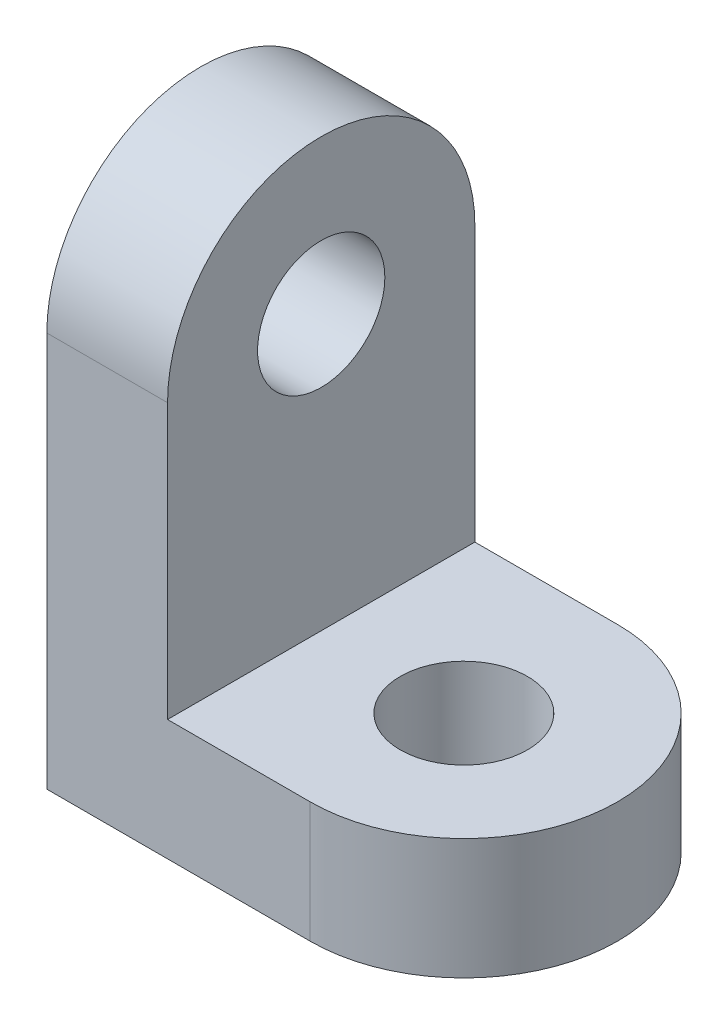
ISO-10303-21;
HEADER;
FILE_DESCRIPTION(('STEP AP214'),'2;1');
FILE_NAME('part.step','',(''),(''),'','','');
FILE_SCHEMA(('AUTOMOTIVE_DESIGN { 1 0 10303 214 1 1 1 1 }'));
ENDSEC;
DATA;
#1=APPLICATION_CONTEXT('core data for automotive mechanical design processes');
#2=APPLICATION_PROTOCOL_DEFINITION('international standard','automotive_design',2000,#1);
#3=PRODUCT_CONTEXT('',#1,'mechanical');
#4=PRODUCT('Part','Part','',(#3));
#5=PRODUCT_RELATED_PRODUCT_CATEGORY('part','',(#4));
#6=PRODUCT_DEFINITION_FORMATION('','',#4);
#7=PRODUCT_DEFINITION_CONTEXT('part definition',#1,'design');
#8=PRODUCT_DEFINITION('design','',#6,#7);
#9=PRODUCT_DEFINITION_SHAPE('','',#8);
#10=(LENGTH_UNIT() NAMED_UNIT(*) SI_UNIT(.MILLI.,.METRE.));
#11=(NAMED_UNIT(*) PLANE_ANGLE_UNIT() SI_UNIT($,.RADIAN.));
#12=(NAMED_UNIT(*) SI_UNIT($,.STERADIAN.) SOLID_ANGLE_UNIT());
#13=UNCERTAINTY_MEASURE_WITH_UNIT(LENGTH_MEASURE(1.E-05),#10,'distance_accuracy_value','');
#14=(GEOMETRIC_REPRESENTATION_CONTEXT(3) GLOBAL_UNCERTAINTY_ASSIGNED_CONTEXT((#13)) GLOBAL_UNIT_ASSIGNED_CONTEXT((#10,
#11,#12)) REPRESENTATION_CONTEXT('',''));
#15=CARTESIAN_POINT('',(0.,0.,0.));
#16=DIRECTION('',(0.,0.,1.));
#17=DIRECTION('',(1.,0.,0.));
#18=AXIS2_PLACEMENT_3D('',#15,#16,#17);
#19=CARTESIAN_POINT('',(-3.,2.75,-3.5));
#20=DIRECTION('',(1.,0.,0.));
#21=DIRECTION('',(0.,0.,-1.));
#22=AXIS2_PLACEMENT_3D('',#19,#20,#21);
#23=PLANE('',#22);
#24=CARTESIAN_POINT('',(-3.,9.,0.));
#25=DIRECTION('',(1.,0.,0.));
#26=DIRECTION('',(0.,0.,-1.));
#27=AXIS2_PLACEMENT_3D('',#24,#25,#26);
#28=CIRCLE('',#27,1.45);
#29=CARTESIAN_POINT('',(-3.,9.,-1.45));
#30=VERTEX_POINT('',#29);
#31=EDGE_CURVE('E114',#30,#30,#28,.T.);
#32=ORIENTED_EDGE('',*,*,#31,.T.);
#33=EDGE_LOOP('',(#32));
#34=FACE_BOUND('',#33,.T.);
#35=DIRECTION('',(0.,0.,1.));
#36=VECTOR('',#35,1.);
#37=CARTESIAN_POINT('',(-3.,0.,-3.5));
#38=LINE('',#37,#36);
#39=CARTESIAN_POINT('',(-3.,0.,-3.5));
#40=VERTEX_POINT('',#39);
#41=CARTESIAN_POINT('',(-3.,0.,3.5));
#42=VERTEX_POINT('',#41);
#43=EDGE_CURVE('E121',#40,#42,#38,.T.);
#44=ORIENTED_EDGE('',*,*,#43,.T.);
#45=DIRECTION('',(0.,-1.,0.));
#46=VECTOR('',#45,1.);
#47=CARTESIAN_POINT('',(-3.,2.75,3.5));
#48=LINE('',#47,#46);
#49=CARTESIAN_POINT('',(-3.,9.,3.5));
#50=VERTEX_POINT('',#49);
#51=EDGE_CURVE('E11',#50,#42,#48,.T.);
#52=ORIENTED_EDGE('',*,*,#51,.F.);
#53=CARTESIAN_POINT('',(-3.,9.,0.));
#54=DIRECTION('',(-1.,0.,0.));
#55=DIRECTION('',(0.,0.,-1.));
#56=AXIS2_PLACEMENT_3D('',#53,#54,#55);
#57=CIRCLE('',#56,3.5);
#58=CARTESIAN_POINT('',(-3.,9.,-3.5));
#59=VERTEX_POINT('',#58);
#60=EDGE_CURVE('E104',#50,#59,#57,.T.);
#61=ORIENTED_EDGE('',*,*,#60,.T.);
#62=DIRECTION('',(0.,-1.,0.));
#63=VECTOR('',#62,1.);
#64=CARTESIAN_POINT('',(-3.,2.75,-3.5));
#65=LINE('',#64,#63);
#66=EDGE_CURVE('E129',#59,#40,#65,.T.);
#67=ORIENTED_EDGE('',*,*,#66,.T.);
#68=EDGE_LOOP('',(#44,#52,#61,#67));
#69=FACE_BOUND('',#68,.T.);
#70=ADVANCED_FACE('F37',(#34,#69),#23,.F.);
#71=CARTESIAN_POINT('',(-3.,2.75,3.5));
#72=DIRECTION('',(0.,0.,-1.));
#73=DIRECTION('',(-1.,0.,0.));
#74=AXIS2_PLACEMENT_3D('',#71,#72,#73);
#75=PLANE('',#74);
#76=DIRECTION('',(1.,0.,0.));
#77=VECTOR('',#76,1.);
#78=CARTESIAN_POINT('',(-3.,2.75,3.5));
#79=LINE('',#78,#77);
#80=CARTESIAN_POINT('',(-0.25,2.75,3.5));
#81=VERTEX_POINT('',#80);
#82=CARTESIAN_POINT('',(3.,2.75,3.5));
#83=VERTEX_POINT('',#82);
#84=EDGE_CURVE('E93',#81,#83,#79,.T.);
#85=ORIENTED_EDGE('',*,*,#84,.F.);
#86=DIRECTION('',(0.,1.,0.));
#87=VECTOR('',#86,1.);
#88=CARTESIAN_POINT('',(-0.25,0.,3.5));
#89=LINE('',#88,#87);
#90=CARTESIAN_POINT('',(-0.25,9.,3.5));
#91=VERTEX_POINT('',#90);
#92=EDGE_CURVE('E87',#81,#91,#89,.T.);
#93=ORIENTED_EDGE('',*,*,#92,.T.);
#94=DIRECTION('',(-1.,0.,0.));
#95=VECTOR('',#94,1.);
#96=CARTESIAN_POINT('',(-0.25,9.,3.5));
#97=LINE('',#96,#95);
#98=EDGE_CURVE('E90',#91,#50,#97,.T.);
#99=ORIENTED_EDGE('',*,*,#98,.T.);
#100=ORIENTED_EDGE('',*,*,#51,.T.);
#101=DIRECTION('',(1.,0.,0.));
#102=VECTOR('',#101,1.);
#103=CARTESIAN_POINT('',(-3.,0.,3.5));
#104=LINE('',#103,#102);
#105=CARTESIAN_POINT('',(3.,0.,3.5));
#106=VERTEX_POINT('',#105);
#107=EDGE_CURVE('E132',#42,#106,#104,.T.);
#108=ORIENTED_EDGE('',*,*,#107,.T.);
#109=DIRECTION('',(0.,-1.,0.));
#110=VECTOR('',#109,1.);
#111=CARTESIAN_POINT('',(3.,2.75,3.5));
#112=LINE('',#111,#110);
#113=EDGE_CURVE('E44',#83,#106,#112,.T.);
#114=ORIENTED_EDGE('',*,*,#113,.F.);
#115=EDGE_LOOP('',(#85,#93,#99,#100,#108,#114));
#116=FACE_BOUND('',#115,.T.);
#117=ADVANCED_FACE('F89',(#116),#75,.F.);
#118=CARTESIAN_POINT('',(3.,2.75,0.));
#119=DIRECTION('',(0.,-1.,0.));
#120=DIRECTION('',(0.,0.,-1.));
#121=AXIS2_PLACEMENT_3D('',#118,#119,#120);
#122=CYLINDRICAL_SURFACE('',#121,3.5);
#123=CARTESIAN_POINT('',(3.,0.,0.));
#124=DIRECTION('',(0.,1.,0.));
#125=DIRECTION('',(0.,0.,-1.));
#126=AXIS2_PLACEMENT_3D('',#123,#124,#125);
#127=CIRCLE('',#126,3.5);
#128=CARTESIAN_POINT('',(3.,0.,-3.5));
#129=VERTEX_POINT('',#128);
#130=EDGE_CURVE('E134',#106,#129,#127,.T.);
#131=ORIENTED_EDGE('',*,*,#130,.T.);
#132=DIRECTION('',(0.,-1.,0.));
#133=VECTOR('',#132,1.);
#134=CARTESIAN_POINT('',(3.,2.75,-3.5));
#135=LINE('',#134,#133);
#136=CARTESIAN_POINT('',(3.,2.75,-3.5));
#137=VERTEX_POINT('',#136);
#138=EDGE_CURVE('E139',#137,#129,#135,.T.);
#139=ORIENTED_EDGE('',*,*,#138,.F.);
#140=CARTESIAN_POINT('',(3.,2.75,0.));
#141=DIRECTION('',(0.,1.,0.));
#142=DIRECTION('',(0.,0.,-1.));
#143=AXIS2_PLACEMENT_3D('',#140,#141,#142);
#144=CIRCLE('',#143,3.5);
#145=EDGE_CURVE('E125',#83,#137,#144,.T.);
#146=ORIENTED_EDGE('',*,*,#145,.F.);
#147=ORIENTED_EDGE('',*,*,#113,.T.);
#148=EDGE_LOOP('',(#131,#139,#146,#147));
#149=FACE_BOUND('',#148,.T.);
#150=ADVANCED_FACE('F145',(#149),#122,.T.);
#151=CARTESIAN_POINT('',(-3.,2.75,-3.5));
#152=DIRECTION('',(0.,0.,1.));
#153=DIRECTION('',(1.,0.,0.));
#154=AXIS2_PLACEMENT_3D('',#151,#152,#153);
#155=PLANE('',#154);
#156=DIRECTION('',(-1.,0.,0.));
#157=VECTOR('',#156,1.);
#158=CARTESIAN_POINT('',(-3.,0.,-3.5));
#159=LINE('',#158,#157);
#160=EDGE_CURVE('E126',#129,#40,#159,.T.);
#161=ORIENTED_EDGE('',*,*,#160,.T.);
#162=ORIENTED_EDGE('',*,*,#66,.F.);
#163=DIRECTION('',(-1.,0.,0.));
#164=VECTOR('',#163,1.);
#165=CARTESIAN_POINT('',(-0.250000000000001,9.,-3.5));
#166=LINE('',#165,#164);
#167=CARTESIAN_POINT('',(-0.250000000000001,9.,-3.5));
#168=VERTEX_POINT('',#167);
#169=EDGE_CURVE('E105',#168,#59,#166,.T.);
#170=ORIENTED_EDGE('',*,*,#169,.F.);
#171=DIRECTION('',(0.,-1.,0.));
#172=VECTOR('',#171,1.);
#173=CARTESIAN_POINT('',(-0.250000000000001,0.,-3.5));
#174=LINE('',#173,#172);
#175=CARTESIAN_POINT('',(-0.25,2.75,-3.5));
#176=VERTEX_POINT('',#175);
#177=EDGE_CURVE('E97',#168,#176,#174,.T.);
#178=ORIENTED_EDGE('',*,*,#177,.T.);
#179=DIRECTION('',(-1.,0.,0.));
#180=VECTOR('',#179,1.);
#181=CARTESIAN_POINT('',(-3.,2.75,-3.5));
#182=LINE('',#181,#180);
#183=EDGE_CURVE('E51',#137,#176,#182,.T.);
#184=ORIENTED_EDGE('',*,*,#183,.F.);
#185=ORIENTED_EDGE('',*,*,#138,.T.);
#186=EDGE_LOOP('',(#161,#162,#170,#178,#184,#185));
#187=FACE_BOUND('',#186,.T.);
#188=ADVANCED_FACE('F153',(#187),#155,.F.);
#189=CARTESIAN_POINT('',(3.,2.75,0.));
#190=DIRECTION('',(0.,-1.,0.));
#191=DIRECTION('',(0.,0.,-1.));
#192=AXIS2_PLACEMENT_3D('',#189,#190,#191);
#193=PLANE('',#192);
#194=CARTESIAN_POINT('',(3.,2.75,0.));
#195=DIRECTION('',(0.,1.,0.));
#196=DIRECTION('',(0.,0.,1.));
#197=AXIS2_PLACEMENT_3D('',#194,#195,#196);
#198=CIRCLE('',#197,1.45);
#199=CARTESIAN_POINT('',(3.,2.75,1.45));
#200=VERTEX_POINT('',#199);
#201=EDGE_CURVE('E117',#200,#200,#198,.T.);
#202=ORIENTED_EDGE('',*,*,#201,.F.);
#203=EDGE_LOOP('',(#202));
#204=FACE_BOUND('',#203,.T.);
#205=ORIENTED_EDGE('',*,*,#183,.T.);
#206=DIRECTION('',(0.,0.,1.));
#207=VECTOR('',#206,1.);
#208=CARTESIAN_POINT('',(-0.25,2.75,0.));
#209=LINE('',#208,#207);
#210=EDGE_CURVE('E55',#176,#81,#209,.T.);
#211=ORIENTED_EDGE('',*,*,#210,.T.);
#212=ORIENTED_EDGE('',*,*,#84,.T.);
#213=ORIENTED_EDGE('',*,*,#145,.T.);
#214=EDGE_LOOP('',(#205,#211,#212,#213));
#215=FACE_BOUND('',#214,.T.);
#216=ADVANCED_FACE('F183',(#204,#215),#193,.F.);
#217=CARTESIAN_POINT('',(3.,0.,0.));
#218=DIRECTION('',(0.,-1.,0.));
#219=DIRECTION('',(0.,0.,-1.));
#220=AXIS2_PLACEMENT_3D('',#217,#218,#219);
#221=PLANE('',#220);
#222=ORIENTED_EDGE('',*,*,#130,.F.);
#223=ORIENTED_EDGE('',*,*,#107,.F.);
#224=ORIENTED_EDGE('',*,*,#43,.F.);
#225=ORIENTED_EDGE('',*,*,#160,.F.);
#226=EDGE_LOOP('',(#222,#223,#224,#225));
#227=FACE_BOUND('',#226,.T.);
#228=CARTESIAN_POINT('',(3.,0.,0.));
#229=DIRECTION('',(0.,1.,0.));
#230=DIRECTION('',(0.,0.,1.));
#231=AXIS2_PLACEMENT_3D('',#228,#229,#230);
#232=CIRCLE('',#231,1.45);
#233=CARTESIAN_POINT('',(3.,0.,1.45));
#234=VERTEX_POINT('',#233);
#235=EDGE_CURVE('E118',#234,#234,#232,.T.);
#236=ORIENTED_EDGE('',*,*,#235,.T.);
#237=EDGE_LOOP('',(#236));
#238=FACE_BOUND('',#237,.T.);
#239=ADVANCED_FACE('F149',(#227,#238),#221,.T.);
#240=CARTESIAN_POINT('',(3.,0.,0.));
#241=DIRECTION('',(0.,1.,0.));
#242=DIRECTION('',(0.,0.,1.));
#243=AXIS2_PLACEMENT_3D('',#240,#241,#242);
#244=CYLINDRICAL_SURFACE('',#243,1.45);
#245=ORIENTED_EDGE('',*,*,#235,.F.);
#246=EDGE_LOOP('',(#245));
#247=FACE_BOUND('',#246,.T.);
#248=ORIENTED_EDGE('',*,*,#201,.T.);
#249=EDGE_LOOP('',(#248));
#250=FACE_BOUND('',#249,.T.);
#251=ADVANCED_FACE('F172',(#247,#250),#244,.F.);
#252=CARTESIAN_POINT('',(-0.25,9.,0.));
#253=DIRECTION('',(1.,0.,0.));
#254=DIRECTION('',(0.,0.,-1.));
#255=AXIS2_PLACEMENT_3D('',#252,#253,#254);
#256=PLANE('',#255);
#257=CARTESIAN_POINT('',(-0.25,9.,0.));
#258=DIRECTION('',(1.,0.,0.));
#259=DIRECTION('',(0.,0.,-1.));
#260=AXIS2_PLACEMENT_3D('',#257,#258,#259);
#261=CIRCLE('',#260,1.45);
#262=CARTESIAN_POINT('',(-0.25,9.,-1.45));
#263=VERTEX_POINT('',#262);
#264=EDGE_CURVE('E163',#263,#263,#261,.T.);
#265=ORIENTED_EDGE('',*,*,#264,.F.);
#266=EDGE_LOOP('',(#265));
#267=FACE_BOUND('',#266,.T.);
#268=ORIENTED_EDGE('',*,*,#210,.F.);
#269=ORIENTED_EDGE('',*,*,#177,.F.);
#270=CARTESIAN_POINT('',(-0.25,9.,0.));
#271=DIRECTION('',(-1.,0.,0.));
#272=DIRECTION('',(0.,0.,-1.));
#273=AXIS2_PLACEMENT_3D('',#270,#271,#272);
#274=CIRCLE('',#273,3.5);
#275=EDGE_CURVE('E96',#91,#168,#274,.T.);
#276=ORIENTED_EDGE('',*,*,#275,.F.);
#277=ORIENTED_EDGE('',*,*,#92,.F.);
#278=EDGE_LOOP('',(#268,#269,#276,#277));
#279=FACE_BOUND('',#278,.T.);
#280=ADVANCED_FACE('F108',(#267,#279),#256,.T.);
#281=CARTESIAN_POINT('',(-0.25,9.,0.));
#282=DIRECTION('',(-1.,0.,0.));
#283=DIRECTION('',(0.,0.,1.));
#284=AXIS2_PLACEMENT_3D('',#281,#282,#283);
#285=CYLINDRICAL_SURFACE('',#284,3.5);
#286=ORIENTED_EDGE('',*,*,#60,.F.);
#287=ORIENTED_EDGE('',*,*,#98,.F.);
#288=ORIENTED_EDGE('',*,*,#275,.T.);
#289=ORIENTED_EDGE('',*,*,#169,.T.);
#290=EDGE_LOOP('',(#286,#287,#288,#289));
#291=FACE_BOUND('',#290,.T.);
#292=ADVANCED_FACE('F101',(#291),#285,.T.);
#293=CARTESIAN_POINT('',(-3.,9.,0.));
#294=DIRECTION('',(1.,0.,0.));
#295=DIRECTION('',(0.,0.,-1.));
#296=AXIS2_PLACEMENT_3D('',#293,#294,#295);
#297=CYLINDRICAL_SURFACE('',#296,1.45);
#298=ORIENTED_EDGE('',*,*,#31,.F.);
#299=EDGE_LOOP('',(#298));
#300=FACE_BOUND('',#299,.T.);
#301=ORIENTED_EDGE('',*,*,#264,.T.);
#302=EDGE_LOOP('',(#301));
#303=FACE_BOUND('',#302,.T.);
#304=ADVANCED_FACE('F169',(#300,#303),#297,.F.);
#305=CLOSED_SHELL('',(#70,#117,#150,#188,#216,#239,#251,#280,#292,#304));
#306=MANIFOLD_SOLID_BREP('B2',#305);
#307=ADVANCED_BREP_SHAPE_REPRESENTATION('',(#18,#306),#14);
#308=SHAPE_DEFINITION_REPRESENTATION(#9,#307);
ENDSEC;
END-ISO-10303-21;
